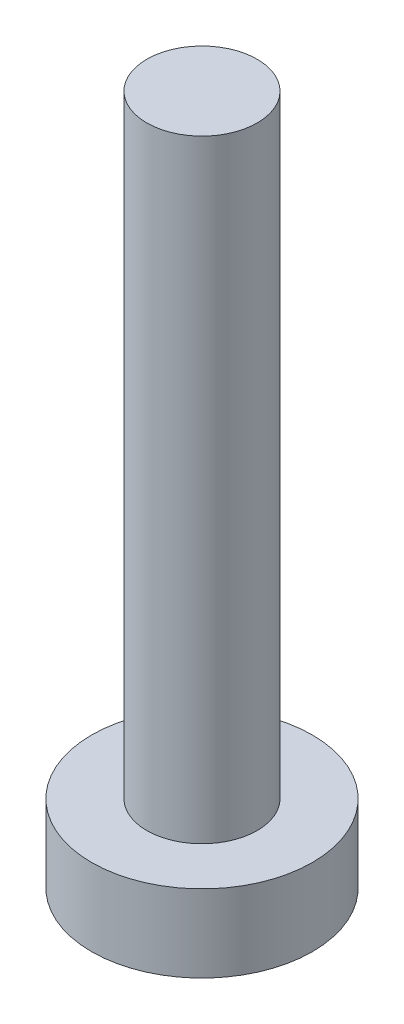
ISO-10303-21;
HEADER;
FILE_DESCRIPTION(('STEP AP214'),'2;1');
FILE_NAME('part.step','',(''),(''),'','','');
FILE_SCHEMA(('AUTOMOTIVE_DESIGN { 1 0 10303 214 1 1 1 1 }'));
ENDSEC;
DATA;
#1=APPLICATION_CONTEXT('core data for automotive mechanical design processes');
#2=APPLICATION_PROTOCOL_DEFINITION('international standard','automotive_design',2000,#1);
#3=PRODUCT_CONTEXT('',#1,'mechanical');
#4=PRODUCT('Part','Part','',(#3));
#5=PRODUCT_RELATED_PRODUCT_CATEGORY('part','',(#4));
#6=PRODUCT_DEFINITION_FORMATION('','',#4);
#7=PRODUCT_DEFINITION_CONTEXT('part definition',#1,'design');
#8=PRODUCT_DEFINITION('design','',#6,#7);
#9=PRODUCT_DEFINITION_SHAPE('','',#8);
#10=(LENGTH_UNIT() NAMED_UNIT(*) SI_UNIT(.MILLI.,.METRE.));
#11=(NAMED_UNIT(*) PLANE_ANGLE_UNIT() SI_UNIT($,.RADIAN.));
#12=(NAMED_UNIT(*) SI_UNIT($,.STERADIAN.) SOLID_ANGLE_UNIT());
#13=UNCERTAINTY_MEASURE_WITH_UNIT(LENGTH_MEASURE(1.E-05),#10,'distance_accuracy_value','');
#14=(GEOMETRIC_REPRESENTATION_CONTEXT(3) GLOBAL_UNCERTAINTY_ASSIGNED_CONTEXT((#13)) GLOBAL_UNIT_ASSIGNED_CONTEXT((#10,
#11,#12)) REPRESENTATION_CONTEXT('',''));
#15=CARTESIAN_POINT('',(0.,0.,0.));
#16=DIRECTION('',(0.,0.,1.));
#17=DIRECTION('',(1.,0.,0.));
#18=AXIS2_PLACEMENT_3D('',#15,#16,#17);
#19=CARTESIAN_POINT('',(0.,2.8,0.));
#20=DIRECTION('',(0.,-1.,0.));
#21=DIRECTION('',(0.,0.,-1.));
#22=AXIS2_PLACEMENT_3D('',#19,#20,#21);
#23=CYLINDRICAL_SURFACE('',#22,4.);
#24=CARTESIAN_POINT('',(0.,2.8,0.));
#25=DIRECTION('',(0.,1.,0.));
#26=DIRECTION('',(0.,0.,1.));
#27=AXIS2_PLACEMENT_3D('',#24,#25,#26);
#28=CIRCLE('',#27,4.);
#29=CARTESIAN_POINT('',(0.,2.8,4.));
#30=VERTEX_POINT('',#29);
#31=EDGE_CURVE('E46',#30,#30,#28,.T.);
#32=ORIENTED_EDGE('',*,*,#31,.F.);
#33=EDGE_LOOP('',(#32));
#34=FACE_BOUND('',#33,.T.);
#35=CARTESIAN_POINT('',(0.,0.,0.));
#36=DIRECTION('',(0.,1.,0.));
#37=DIRECTION('',(0.,0.,1.));
#38=AXIS2_PLACEMENT_3D('',#35,#36,#37);
#39=CIRCLE('',#38,4.);
#40=CARTESIAN_POINT('',(0.,0.,4.));
#41=VERTEX_POINT('',#40);
#42=EDGE_CURVE('E45',#41,#41,#39,.T.);
#43=ORIENTED_EDGE('',*,*,#42,.T.);
#44=EDGE_LOOP('',(#43));
#45=FACE_BOUND('',#44,.T.);
#46=ADVANCED_FACE('F39',(#34,#45),#23,.T.);
#47=CARTESIAN_POINT('',(0.,2.8,0.));
#48=DIRECTION('',(0.,1.,0.));
#49=DIRECTION('',(0.,0.,1.));
#50=AXIS2_PLACEMENT_3D('',#47,#48,#49);
#51=PLANE('',#50);
#52=CARTESIAN_POINT('',(0.,2.8,0.));
#53=DIRECTION('',(0.,1.,0.));
#54=DIRECTION('',(0.,0.,1.));
#55=AXIS2_PLACEMENT_3D('',#52,#53,#54);
#56=CIRCLE('',#55,2.);
#57=CARTESIAN_POINT('',(0.,2.8,2.));
#58=VERTEX_POINT('',#57);
#59=EDGE_CURVE('E10',#58,#58,#56,.T.);
#60=ORIENTED_EDGE('',*,*,#59,.F.);
#61=EDGE_LOOP('',(#60));
#62=FACE_BOUND('',#61,.T.);
#63=ORIENTED_EDGE('',*,*,#31,.T.);
#64=EDGE_LOOP('',(#63));
#65=FACE_BOUND('',#64,.T.);
#66=ADVANCED_FACE('F61',(#62,#65),#51,.T.);
#67=CARTESIAN_POINT('',(0.,0.,0.));
#68=DIRECTION('',(0.,1.,0.));
#69=DIRECTION('',(0.,0.,1.));
#70=AXIS2_PLACEMENT_3D('',#67,#68,#69);
#71=PLANE('',#70);
#72=ORIENTED_EDGE('',*,*,#42,.F.);
#73=EDGE_LOOP('',(#72));
#74=FACE_BOUND('',#73,.T.);
#75=ADVANCED_FACE('F58',(#74),#71,.F.);
#76=CARTESIAN_POINT('',(0.,25.,0.));
#77=DIRECTION('',(0.,-1.,0.));
#78=DIRECTION('',(0.,0.,-1.));
#79=AXIS2_PLACEMENT_3D('',#76,#77,#78);
#80=CYLINDRICAL_SURFACE('',#79,2.);
#81=CARTESIAN_POINT('',(0.,25.,0.));
#82=DIRECTION('',(0.,1.,0.));
#83=DIRECTION('',(0.,0.,1.));
#84=AXIS2_PLACEMENT_3D('',#81,#82,#83);
#85=CIRCLE('',#84,2.);
#86=CARTESIAN_POINT('',(0.,25.,2.));
#87=VERTEX_POINT('',#86);
#88=EDGE_CURVE('E55',#87,#87,#85,.T.);
#89=ORIENTED_EDGE('',*,*,#88,.F.);
#90=EDGE_LOOP('',(#89));
#91=FACE_BOUND('',#90,.T.);
#92=ORIENTED_EDGE('',*,*,#59,.T.);
#93=EDGE_LOOP('',(#92));
#94=FACE_BOUND('',#93,.T.);
#95=ADVANCED_FACE('F65',(#91,#94),#80,.T.);
#96=CARTESIAN_POINT('',(0.,25.,0.));
#97=DIRECTION('',(0.,1.,0.));
#98=DIRECTION('',(0.,0.,1.));
#99=AXIS2_PLACEMENT_3D('',#96,#97,#98);
#100=PLANE('',#99);
#101=ORIENTED_EDGE('',*,*,#88,.T.);
#102=EDGE_LOOP('',(#101));
#103=FACE_BOUND('',#102,.T.);
#104=ADVANCED_FACE('F69',(#103),#100,.T.);
#105=CLOSED_SHELL('',(#46,#66,#75,#95,#104));
#106=MANIFOLD_SOLID_BREP('B2',#105);
#107=ADVANCED_BREP_SHAPE_REPRESENTATION('',(#18,#106),#14);
#108=SHAPE_DEFINITION_REPRESENTATION(#9,#107);
ENDSEC;
END-ISO-10303-21;
